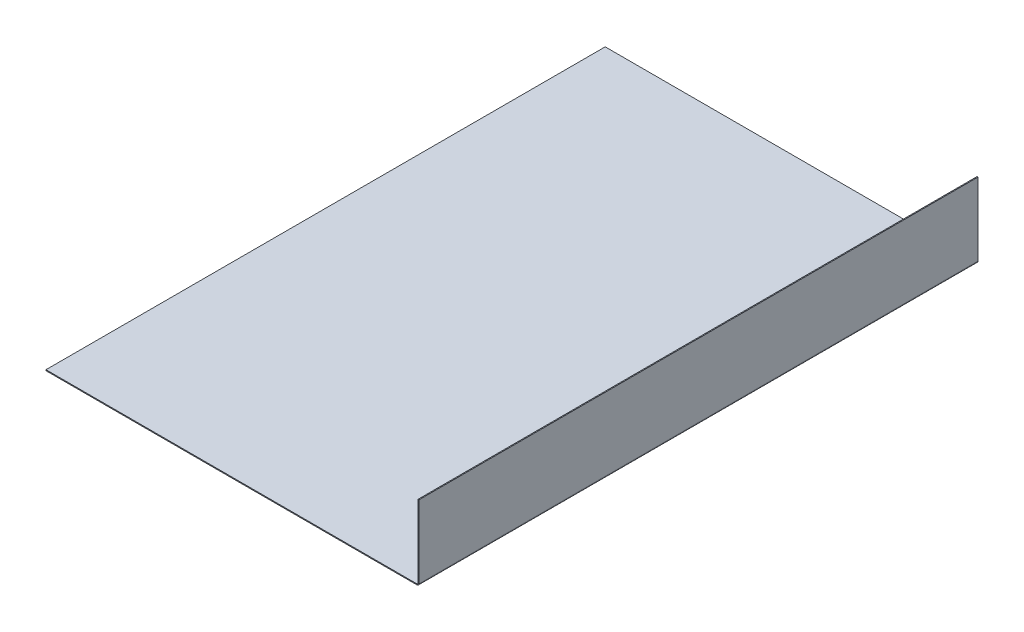
ISO-10303-21;
HEADER;
FILE_DESCRIPTION(('STEP AP214'),'2;1');
FILE_NAME('part.step','',(''),(''),'','','');
FILE_SCHEMA(('AUTOMOTIVE_DESIGN { 1 0 10303 214 1 1 1 1 }'));
ENDSEC;
DATA;
#1=APPLICATION_CONTEXT('core data for automotive mechanical design processes');
#2=APPLICATION_PROTOCOL_DEFINITION('international standard','automotive_design',2000,#1);
#3=PRODUCT_CONTEXT('',#1,'mechanical');
#4=PRODUCT('Part','Part','',(#3));
#5=PRODUCT_RELATED_PRODUCT_CATEGORY('part','',(#4));
#6=PRODUCT_DEFINITION_FORMATION('','',#4);
#7=PRODUCT_DEFINITION_CONTEXT('part definition',#1,'design');
#8=PRODUCT_DEFINITION('design','',#6,#7);
#9=PRODUCT_DEFINITION_SHAPE('','',#8);
#10=(LENGTH_UNIT() NAMED_UNIT(*) SI_UNIT(.MILLI.,.METRE.));
#11=(NAMED_UNIT(*) PLANE_ANGLE_UNIT() SI_UNIT($,.RADIAN.));
#12=(NAMED_UNIT(*) SI_UNIT($,.STERADIAN.) SOLID_ANGLE_UNIT());
#13=UNCERTAINTY_MEASURE_WITH_UNIT(LENGTH_MEASURE(1.E-05),#10,'distance_accuracy_value','');
#14=(GEOMETRIC_REPRESENTATION_CONTEXT(3) GLOBAL_UNCERTAINTY_ASSIGNED_CONTEXT((#13)) GLOBAL_UNIT_ASSIGNED_CONTEXT((#10,
#11,#12)) REPRESENTATION_CONTEXT('',''));
#15=CARTESIAN_POINT('',(0.,0.,0.));
#16=DIRECTION('',(0.,0.,1.));
#17=DIRECTION('',(1.,0.,0.));
#18=AXIS2_PLACEMENT_3D('',#15,#16,#17);
#19=CARTESIAN_POINT('',(-500.,2.5,750.));
#20=DIRECTION('',(0.,1.,0.));
#21=DIRECTION('',(1.,0.,0.));
#22=AXIS2_PLACEMENT_3D('',#19,#20,#21);
#23=PLANE('',#22);
#24=DIRECTION('',(0.,0.,-1.));
#25=VECTOR('',#24,1.);
#26=CARTESIAN_POINT('',(-5.,2.5,375.));
#27=LINE('',#26,#25);
#28=CARTESIAN_POINT('',(-5.,2.5,1500.));
#29=VERTEX_POINT('',#28);
#30=CARTESIAN_POINT('',(-5.,2.5,0.));
#31=VERTEX_POINT('',#30);
#32=EDGE_CURVE('E123',#29,#31,#27,.T.);
#33=ORIENTED_EDGE('',*,*,#32,.T.);
#34=DIRECTION('',(1.,0.,0.));
#35=VECTOR('',#34,1.);
#36=CARTESIAN_POINT('',(0.,2.5,0.));
#37=LINE('',#36,#35);
#38=CARTESIAN_POINT('',(-1000.,2.5,0.));
#39=VERTEX_POINT('',#38);
#40=EDGE_CURVE('E180',#39,#31,#37,.T.);
#41=ORIENTED_EDGE('',*,*,#40,.F.);
#42=DIRECTION('',(0.,0.,-1.));
#43=VECTOR('',#42,1.);
#44=CARTESIAN_POINT('',(-1000.,2.5,0.));
#45=LINE('',#44,#43);
#46=CARTESIAN_POINT('',(-1000.,2.5,1500.));
#47=VERTEX_POINT('',#46);
#48=EDGE_CURVE('E11',#47,#39,#45,.T.);
#49=ORIENTED_EDGE('',*,*,#48,.F.);
#50=DIRECTION('',(-1.,0.,0.));
#51=VECTOR('',#50,1.);
#52=CARTESIAN_POINT('',(-1000.,2.5,1500.));
#53=LINE('',#52,#51);
#54=EDGE_CURVE('E167',#29,#47,#53,.T.);
#55=ORIENTED_EDGE('',*,*,#54,.F.);
#56=EDGE_LOOP('',(#33,#41,#49,#55));
#57=FACE_BOUND('',#56,.T.);
#58=ADVANCED_FACE('F17',(#57),#23,.T.);
#59=CARTESIAN_POINT('',(-1000.,0.,1500.));
#60=DIRECTION('',(-1.,0.,0.));
#61=DIRECTION('',(0.,1.,0.));
#62=AXIS2_PLACEMENT_3D('',#59,#60,#61);
#63=PLANE('',#62);
#64=ORIENTED_EDGE('',*,*,#48,.T.);
#65=DIRECTION('',(0.,1.,0.));
#66=VECTOR('',#65,1.);
#67=CARTESIAN_POINT('',(-1000.,0.,0.));
#68=LINE('',#67,#66);
#69=CARTESIAN_POINT('',(-1000.,0.,0.));
#70=VERTEX_POINT('',#69);
#71=EDGE_CURVE('E176',#70,#39,#68,.T.);
#72=ORIENTED_EDGE('',*,*,#71,.F.);
#73=DIRECTION('',(0.,0.,1.));
#74=VECTOR('',#73,1.);
#75=CARTESIAN_POINT('',(-1000.,0.,0.));
#76=LINE('',#75,#74);
#77=CARTESIAN_POINT('',(-1000.,0.,1500.));
#78=VERTEX_POINT('',#77);
#79=EDGE_CURVE('E163',#70,#78,#76,.T.);
#80=ORIENTED_EDGE('',*,*,#79,.T.);
#81=DIRECTION('',(0.,1.,0.));
#82=VECTOR('',#81,1.);
#83=CARTESIAN_POINT('',(-1000.,0.,1500.));
#84=LINE('',#83,#82);
#85=EDGE_CURVE('E27',#78,#47,#84,.T.);
#86=ORIENTED_EDGE('',*,*,#85,.T.);
#87=EDGE_LOOP('',(#64,#72,#80,#86));
#88=FACE_BOUND('',#87,.T.);
#89=ADVANCED_FACE('F324',(#88),#63,.T.);
#90=CARTESIAN_POINT('',(0.,0.,1500.));
#91=DIRECTION('',(0.,0.,1.));
#92=DIRECTION('',(1.,0.,0.));
#93=AXIS2_PLACEMENT_3D('',#90,#91,#92);
#94=PLANE('',#93);
#95=DIRECTION('',(0.,1.,0.));
#96=VECTOR('',#95,1.);
#97=CARTESIAN_POINT('',(-5.,1.25,1500.));
#98=LINE('',#97,#96);
#99=CARTESIAN_POINT('',(-5.,0.,1500.));
#100=VERTEX_POINT('',#99);
#101=EDGE_CURVE('E148',#100,#29,#98,.T.);
#102=ORIENTED_EDGE('',*,*,#101,.T.);
#103=ORIENTED_EDGE('',*,*,#54,.T.);
#104=ORIENTED_EDGE('',*,*,#85,.F.);
#105=DIRECTION('',(1.,0.,0.));
#106=VECTOR('',#105,1.);
#107=CARTESIAN_POINT('',(-1000.,0.,1500.));
#108=LINE('',#107,#106);
#109=EDGE_CURVE('E168',#78,#100,#108,.T.);
#110=ORIENTED_EDGE('',*,*,#109,.T.);
#111=EDGE_LOOP('',(#102,#103,#104,#110));
#112=FACE_BOUND('',#111,.T.);
#113=ADVANCED_FACE('F329',(#112),#94,.T.);
#114=CARTESIAN_POINT('',(-500.,0.,750.));
#115=DIRECTION('',(0.,1.,0.));
#116=DIRECTION('',(1.,0.,0.));
#117=AXIS2_PLACEMENT_3D('',#114,#115,#116);
#118=PLANE('',#117);
#119=DIRECTION('',(0.,0.,1.));
#120=VECTOR('',#119,1.);
#121=CARTESIAN_POINT('',(-5.,0.,375.));
#122=LINE('',#121,#120);
#123=CARTESIAN_POINT('',(-5.,0.,0.));
#124=VERTEX_POINT('',#123);
#125=EDGE_CURVE('E159',#124,#100,#122,.T.);
#126=ORIENTED_EDGE('',*,*,#125,.T.);
#127=ORIENTED_EDGE('',*,*,#109,.F.);
#128=ORIENTED_EDGE('',*,*,#79,.F.);
#129=DIRECTION('',(-1.,0.,0.));
#130=VECTOR('',#129,1.);
#131=CARTESIAN_POINT('',(0.,0.,0.));
#132=LINE('',#131,#130);
#133=EDGE_CURVE('E181',#124,#70,#132,.T.);
#134=ORIENTED_EDGE('',*,*,#133,.F.);
#135=EDGE_LOOP('',(#126,#127,#128,#134));
#136=FACE_BOUND('',#135,.T.);
#137=ADVANCED_FACE('F337',(#136),#118,.F.);
#138=CARTESIAN_POINT('',(-1000.,0.,0.));
#139=DIRECTION('',(0.,0.,-1.));
#140=DIRECTION('',(0.,-1.,0.));
#141=AXIS2_PLACEMENT_3D('',#138,#139,#140);
#142=PLANE('',#141);
#143=DIRECTION('',(0.,-1.,0.));
#144=VECTOR('',#143,1.);
#145=CARTESIAN_POINT('',(-5.,1.25,0.));
#146=LINE('',#145,#144);
#147=EDGE_CURVE('E150',#31,#124,#146,.T.);
#148=ORIENTED_EDGE('',*,*,#147,.T.);
#149=ORIENTED_EDGE('',*,*,#133,.T.);
#150=ORIENTED_EDGE('',*,*,#71,.T.);
#151=ORIENTED_EDGE('',*,*,#40,.T.);
#152=EDGE_LOOP('',(#148,#149,#150,#151));
#153=FACE_BOUND('',#152,.T.);
#154=ADVANCED_FACE('F334',(#153),#142,.T.);
#155=CARTESIAN_POINT('',(-5.,5.,750.));
#156=DIRECTION('',(0.,0.,1.));
#157=DIRECTION('',(0.,-1.,0.));
#158=AXIS2_PLACEMENT_3D('',#155,#156,#157);
#159=CYLINDRICAL_SURFACE('',#158,2.5);
#160=DIRECTION('',(0.,0.,1.));
#161=VECTOR('',#160,1.);
#162=CARTESIAN_POINT('',(-2.5,5.,750.));
#163=LINE('',#162,#161);
#164=CARTESIAN_POINT('',(-2.5,5.,0.));
#165=VERTEX_POINT('',#164);
#166=CARTESIAN_POINT('',(-2.5,5.,1500.));
#167=VERTEX_POINT('',#166);
#168=EDGE_CURVE('E129',#165,#167,#163,.T.);
#169=ORIENTED_EDGE('',*,*,#168,.F.);
#170=CARTESIAN_POINT('',(-5.,5.,0.));
#171=DIRECTION('',(0.,0.,-1.));
#172=DIRECTION('',(1.,0.,0.));
#173=AXIS2_PLACEMENT_3D('',#170,#171,#172);
#174=CIRCLE('',#173,2.5);
#175=EDGE_CURVE('E154',#165,#31,#174,.T.);
#176=ORIENTED_EDGE('',*,*,#175,.T.);
#177=ORIENTED_EDGE('',*,*,#32,.F.);
#178=CARTESIAN_POINT('',(-5.,5.,1500.));
#179=DIRECTION('',(0.,0.,-1.));
#180=DIRECTION('',(1.,0.,0.));
#181=AXIS2_PLACEMENT_3D('',#178,#179,#180);
#182=CIRCLE('',#181,2.5);
#183=EDGE_CURVE('E144',#167,#29,#182,.T.);
#184=ORIENTED_EDGE('',*,*,#183,.F.);
#185=EDGE_LOOP('',(#169,#176,#177,#184));
#186=FACE_BOUND('',#185,.T.);
#187=ADVANCED_FACE('F314',(#186),#159,.F.);
#188=CARTESIAN_POINT('',(0.,99.6725666117692,750.));
#189=DIRECTION('',(-1.,0.,0.));
#190=DIRECTION('',(0.,0.,1.));
#191=AXIS2_PLACEMENT_3D('',#188,#189,#190);
#192=PLANE('',#191);
#193=DIRECTION('',(0.,0.,-1.));
#194=VECTOR('',#193,1.);
#195=CARTESIAN_POINT('',(0.,5.,750.));
#196=LINE('',#195,#194);
#197=CARTESIAN_POINT('',(0.,5.,1500.));
#198=VERTEX_POINT('',#197);
#199=CARTESIAN_POINT('',(0.,5.,0.));
#200=VERTEX_POINT('',#199);
#201=EDGE_CURVE('E127',#198,#200,#196,.T.);
#202=ORIENTED_EDGE('',*,*,#201,.T.);
#203=DIRECTION('',(0.,-1.,0.));
#204=VECTOR('',#203,1.);
#205=CARTESIAN_POINT('',(0.,-6.30973355292326,0.));
#206=LINE('',#205,#204);
#207=CARTESIAN_POINT('',(0.,200.,0.));
#208=VERTEX_POINT('',#207);
#209=EDGE_CURVE('E78',#208,#200,#206,.T.);
#210=ORIENTED_EDGE('',*,*,#209,.F.);
#211=DIRECTION('',(0.,0.,-1.));
#212=VECTOR('',#211,1.);
#213=CARTESIAN_POINT('',(0.,200.,1500.));
#214=LINE('',#213,#212);
#215=CARTESIAN_POINT('',(0.,200.,1500.));
#216=VERTEX_POINT('',#215);
#217=EDGE_CURVE('E117',#216,#208,#214,.T.);
#218=ORIENTED_EDGE('',*,*,#217,.F.);
#219=DIRECTION('',(0.,1.,0.));
#220=VECTOR('',#219,1.);
#221=CARTESIAN_POINT('',(0.,5.,1500.));
#222=LINE('',#221,#220);
#223=EDGE_CURVE('E92',#198,#216,#222,.T.);
#224=ORIENTED_EDGE('',*,*,#223,.F.);
#225=EDGE_LOOP('',(#202,#210,#218,#224));
#226=FACE_BOUND('',#225,.T.);
#227=ADVANCED_FACE('F125',(#226),#192,.F.);
#228=CARTESIAN_POINT('',(-2.5,200.,1500.));
#229=DIRECTION('',(0.,1.,0.));
#230=DIRECTION('',(1.,0.,0.));
#231=AXIS2_PLACEMENT_3D('',#228,#229,#230);
#232=PLANE('',#231);
#233=ORIENTED_EDGE('',*,*,#217,.T.);
#234=DIRECTION('',(1.,0.,0.));
#235=VECTOR('',#234,1.);
#236=CARTESIAN_POINT('',(-2.5,200.,0.));
#237=LINE('',#236,#235);
#238=CARTESIAN_POINT('',(-2.5,200.,0.));
#239=VERTEX_POINT('',#238);
#240=EDGE_CURVE('E119',#239,#208,#237,.T.);
#241=ORIENTED_EDGE('',*,*,#240,.F.);
#242=DIRECTION('',(0.,0.,-1.));
#243=VECTOR('',#242,1.);
#244=CARTESIAN_POINT('',(-2.5,200.,1500.));
#245=LINE('',#244,#243);
#246=CARTESIAN_POINT('',(-2.5,200.,1500.));
#247=VERTEX_POINT('',#246);
#248=EDGE_CURVE('E110',#247,#239,#245,.T.);
#249=ORIENTED_EDGE('',*,*,#248,.F.);
#250=DIRECTION('',(1.,0.,0.));
#251=VECTOR('',#250,1.);
#252=CARTESIAN_POINT('',(-2.5,200.,1500.));
#253=LINE('',#252,#251);
#254=EDGE_CURVE('E121',#247,#216,#253,.T.);
#255=ORIENTED_EDGE('',*,*,#254,.T.);
#256=EDGE_LOOP('',(#233,#241,#249,#255));
#257=FACE_BOUND('',#256,.T.);
#258=ADVANCED_FACE('F118',(#257),#232,.T.);
#259=CARTESIAN_POINT('',(-2.5,5.,1500.));
#260=DIRECTION('',(0.,0.,1.));
#261=DIRECTION('',(1.,0.,0.));
#262=AXIS2_PLACEMENT_3D('',#259,#260,#261);
#263=PLANE('',#262);
#264=DIRECTION('',(1.,0.,0.));
#265=VECTOR('',#264,1.);
#266=CARTESIAN_POINT('',(-1.95,5.,1500.));
#267=LINE('',#266,#265);
#268=EDGE_CURVE('E149',#167,#198,#267,.T.);
#269=ORIENTED_EDGE('',*,*,#268,.T.);
#270=ORIENTED_EDGE('',*,*,#223,.T.);
#271=ORIENTED_EDGE('',*,*,#254,.F.);
#272=DIRECTION('',(0.,-1.,0.));
#273=VECTOR('',#272,1.);
#274=CARTESIAN_POINT('',(-2.5,-6.30973355292326,1500.));
#275=LINE('',#274,#273);
#276=EDGE_CURVE('E162',#247,#167,#275,.T.);
#277=ORIENTED_EDGE('',*,*,#276,.T.);
#278=EDGE_LOOP('',(#269,#270,#271,#277));
#279=FACE_BOUND('',#278,.T.);
#280=ADVANCED_FACE('F299',(#279),#263,.T.);
#281=CARTESIAN_POINT('',(0.,5.,0.));
#282=DIRECTION('',(0.,0.,-1.));
#283=DIRECTION('',(0.,-1.,0.));
#284=AXIS2_PLACEMENT_3D('',#281,#282,#283);
#285=PLANE('',#284);
#286=DIRECTION('',(-1.,0.,0.));
#287=VECTOR('',#286,1.);
#288=CARTESIAN_POINT('',(-1.95,5.,0.));
#289=LINE('',#288,#287);
#290=EDGE_CURVE('E139',#200,#165,#289,.T.);
#291=ORIENTED_EDGE('',*,*,#290,.F.);
#292=CARTESIAN_POINT('',(-5.,5.,0.));
#293=DIRECTION('',(0.,0.,-1.));
#294=DIRECTION('',(1.,0.,0.));
#295=AXIS2_PLACEMENT_3D('',#292,#293,#294);
#296=CIRCLE('',#295,5.);
#297=EDGE_CURVE('E155',#200,#124,#296,.T.);
#298=ORIENTED_EDGE('',*,*,#297,.T.);
#299=ORIENTED_EDGE('',*,*,#147,.F.);
#300=ORIENTED_EDGE('',*,*,#175,.F.);
#301=EDGE_LOOP('',(#291,#298,#299,#300));
#302=FACE_BOUND('',#301,.T.);
#303=ADVANCED_FACE('F310',(#302),#285,.T.);
#304=CARTESIAN_POINT('',(-2.5,5.,1500.));
#305=DIRECTION('',(0.,0.,1.));
#306=DIRECTION('',(1.,0.,0.));
#307=AXIS2_PLACEMENT_3D('',#304,#305,#306);
#308=PLANE('',#307);
#309=ORIENTED_EDGE('',*,*,#268,.F.);
#310=ORIENTED_EDGE('',*,*,#183,.T.);
#311=ORIENTED_EDGE('',*,*,#101,.F.);
#312=CARTESIAN_POINT('',(-5.,5.,1500.));
#313=DIRECTION('',(0.,0.,1.));
#314=DIRECTION('',(0.,-1.,0.));
#315=AXIS2_PLACEMENT_3D('',#312,#313,#314);
#316=CIRCLE('',#315,5.);
#317=EDGE_CURVE('E172',#100,#198,#316,.T.);
#318=ORIENTED_EDGE('',*,*,#317,.T.);
#319=EDGE_LOOP('',(#309,#310,#311,#318));
#320=FACE_BOUND('',#319,.T.);
#321=ADVANCED_FACE('F303',(#320),#308,.T.);
#322=CARTESIAN_POINT('',(-2.5,99.6725666117692,750.));
#323=DIRECTION('',(-1.,0.,0.));
#324=DIRECTION('',(0.,0.,1.));
#325=AXIS2_PLACEMENT_3D('',#322,#323,#324);
#326=PLANE('',#325);
#327=ORIENTED_EDGE('',*,*,#168,.T.);
#328=ORIENTED_EDGE('',*,*,#276,.F.);
#329=ORIENTED_EDGE('',*,*,#248,.T.);
#330=DIRECTION('',(0.,-1.,0.));
#331=VECTOR('',#330,1.);
#332=CARTESIAN_POINT('',(-2.5,-6.30973355292326,0.));
#333=LINE('',#332,#331);
#334=EDGE_CURVE('E132',#239,#165,#333,.T.);
#335=ORIENTED_EDGE('',*,*,#334,.T.);
#336=EDGE_LOOP('',(#327,#328,#329,#335));
#337=FACE_BOUND('',#336,.T.);
#338=ADVANCED_FACE('F19',(#337),#326,.T.);
#339=CARTESIAN_POINT('',(-2.5,5.,0.));
#340=DIRECTION('',(0.,0.,-1.));
#341=DIRECTION('',(0.,-1.,0.));
#342=AXIS2_PLACEMENT_3D('',#339,#340,#341);
#343=PLANE('',#342);
#344=ORIENTED_EDGE('',*,*,#290,.T.);
#345=ORIENTED_EDGE('',*,*,#334,.F.);
#346=ORIENTED_EDGE('',*,*,#240,.T.);
#347=ORIENTED_EDGE('',*,*,#209,.T.);
#348=EDGE_LOOP('',(#344,#345,#346,#347));
#349=FACE_BOUND('',#348,.T.);
#350=ADVANCED_FACE('F131',(#349),#343,.T.);
#351=CARTESIAN_POINT('',(-5.,5.,750.));
#352=DIRECTION('',(0.,0.,1.));
#353=DIRECTION('',(0.,-1.,0.));
#354=AXIS2_PLACEMENT_3D('',#351,#352,#353);
#355=CYLINDRICAL_SURFACE('',#354,5.);
#356=ORIENTED_EDGE('',*,*,#201,.F.);
#357=ORIENTED_EDGE('',*,*,#317,.F.);
#358=ORIENTED_EDGE('',*,*,#125,.F.);
#359=ORIENTED_EDGE('',*,*,#297,.F.);
#360=EDGE_LOOP('',(#356,#357,#358,#359));
#361=FACE_BOUND('',#360,.T.);
#362=ADVANCED_FACE('F307',(#361),#355,.T.);
#363=CLOSED_SHELL('',(#58,#89,#113,#137,#154,#187,#227,#258,#280,#303,#321,#338,#350,#362));
#364=MANIFOLD_SOLID_BREP('B1',#363);
#365=ADVANCED_BREP_SHAPE_REPRESENTATION('',(#18,#364),#14);
#366=SHAPE_DEFINITION_REPRESENTATION(#9,#365);
ENDSEC;
END-ISO-10303-21;
